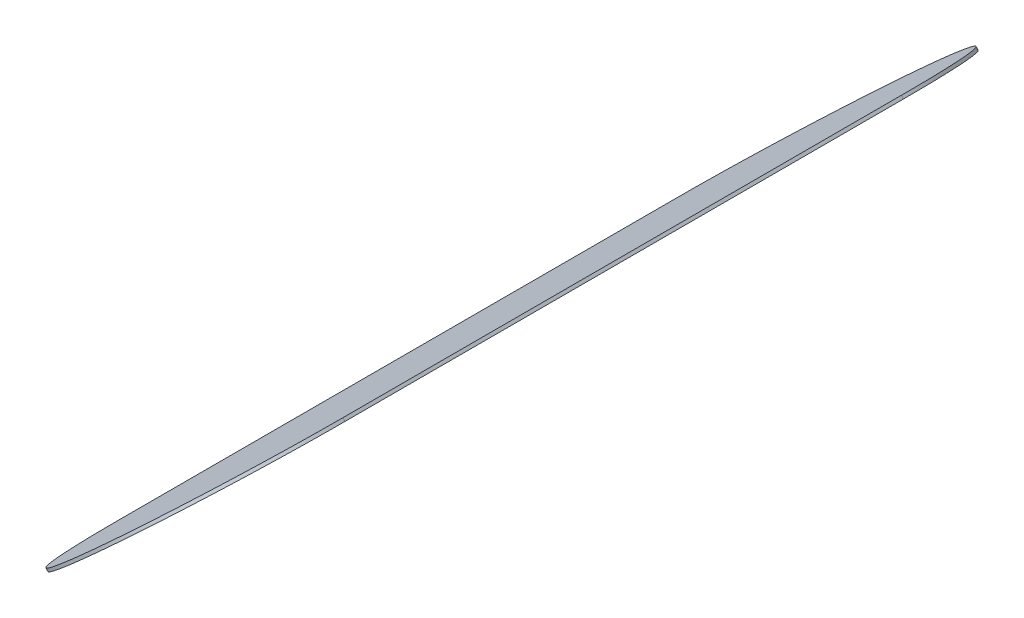
ISO-10303-21;
HEADER;
FILE_DESCRIPTION(('STEP AP214'),'2;1');
FILE_NAME('part.step','',(''),(''),'','','');
FILE_SCHEMA(('AUTOMOTIVE_DESIGN { 1 0 10303 214 1 1 1 1 }'));
ENDSEC;
DATA;
#1=APPLICATION_CONTEXT('core data for automotive mechanical design processes');
#2=APPLICATION_PROTOCOL_DEFINITION('international standard','automotive_design',2000,#1);
#3=PRODUCT_CONTEXT('',#1,'mechanical');
#4=PRODUCT('Part','Part','',(#3));
#5=PRODUCT_RELATED_PRODUCT_CATEGORY('part','',(#4));
#6=PRODUCT_DEFINITION_FORMATION('','',#4);
#7=PRODUCT_DEFINITION_CONTEXT('part definition',#1,'design');
#8=PRODUCT_DEFINITION('design','',#6,#7);
#9=PRODUCT_DEFINITION_SHAPE('','',#8);
#10=(LENGTH_UNIT() NAMED_UNIT(*) SI_UNIT(.MILLI.,.METRE.));
#11=(NAMED_UNIT(*) PLANE_ANGLE_UNIT() SI_UNIT($,.RADIAN.));
#12=(NAMED_UNIT(*) SI_UNIT($,.STERADIAN.) SOLID_ANGLE_UNIT());
#13=UNCERTAINTY_MEASURE_WITH_UNIT(LENGTH_MEASURE(1.E-05),#10,'distance_accuracy_value','');
#14=(GEOMETRIC_REPRESENTATION_CONTEXT(3) GLOBAL_UNCERTAINTY_ASSIGNED_CONTEXT((#13)) GLOBAL_UNIT_ASSIGNED_CONTEXT((#10,
#11,#12)) REPRESENTATION_CONTEXT('',''));
#15=CARTESIAN_POINT('',(0.,0.,0.));
#16=DIRECTION('',(0.,0.,1.));
#17=DIRECTION('',(1.,0.,0.));
#18=AXIS2_PLACEMENT_3D('',#15,#16,#17);
#19=CARTESIAN_POINT('',(-14.2740393675022,92.1058888495094,9.17000719853139));
#20=DIRECTION('',(-0.666666666666666,0.745355992499931,0.));
#21=DIRECTION('',(-0.745355992499931,-0.666666666666666,0.));
#22=AXIS2_PLACEMENT_3D('',#19,#20,#21);
#23=CYLINDRICAL_SURFACE('',#22,4.89999999999999);
#24=CARTESIAN_POINT('',(-14.3407060341689,92.1804244487594,9.17000719853139));
#25=DIRECTION('',(-0.666666666666666,0.745355992499931,0.));
#26=DIRECTION('',(-0.745355992499931,-0.666666666666666,0.));
#27=AXIS2_PLACEMENT_3D('',#24,#25,#26);
#28=CIRCLE('',#27,4.89999999999999);
#29=CARTESIAN_POINT('',(-17.9929503974185,88.9137577820927,9.17000719853139));
#30=VERTEX_POINT('',#29);
#31=CARTESIAN_POINT('',(-10.6884616709192,95.447091115426,9.17000719853139));
#32=VERTEX_POINT('',#31);
#33=EDGE_CURVE('E103',#30,#32,#28,.T.);
#34=ORIENTED_EDGE('',*,*,#33,.F.);
#35=DIRECTION('',(-0.666666666666666,0.745355992499931,0.));
#36=VECTOR('',#35,1.);
#37=CARTESIAN_POINT('',(-17.9262837307519,88.8392221828427,9.17000719853139));
#38=LINE('',#37,#36);
#39=CARTESIAN_POINT('',(-17.9262837307519,88.8392221828427,9.17000719853139));
#40=VERTEX_POINT('',#39);
#41=EDGE_CURVE('E11',#40,#30,#38,.T.);
#42=ORIENTED_EDGE('',*,*,#41,.F.);
#43=CARTESIAN_POINT('',(-14.2740393675022,92.1058888495094,9.17000719853139));
#44=DIRECTION('',(-0.666666666666666,0.745355992499931,0.));
#45=DIRECTION('',(-0.745355992499931,-0.666666666666666,0.));
#46=AXIS2_PLACEMENT_3D('',#43,#44,#45);
#47=CIRCLE('',#46,4.89999999999999);
#48=CARTESIAN_POINT('',(-10.6217950042525,95.372555516176,9.17000719853139));
#49=VERTEX_POINT('',#48);
#50=EDGE_CURVE('E97',#40,#49,#47,.T.);
#51=ORIENTED_EDGE('',*,*,#50,.T.);
#52=DIRECTION('',(-0.666666666666666,0.745355992499931,0.));
#53=VECTOR('',#52,1.);
#54=CARTESIAN_POINT('',(-10.6217950042525,95.372555516176,9.17000719853139));
#55=LINE('',#54,#53);
#56=EDGE_CURVE('E42',#49,#32,#55,.T.);
#57=ORIENTED_EDGE('',*,*,#56,.T.);
#58=EDGE_LOOP('',(#34,#42,#51,#57));
#59=FACE_BOUND('',#58,.T.);
#60=ADVANCED_FACE('F39',(#59),#23,.T.);
#61=CARTESIAN_POINT('',(-17.9262837307519,88.8392221828427,-9.17000719853139));
#62=DIRECTION('',(-0.745355992499931,-0.666666666666666,0.));
#63=DIRECTION('',(0.666666666666666,-0.745355992499931,0.));
#64=AXIS2_PLACEMENT_3D('',#61,#62,#63);
#65=PLANE('',#64);
#66=DIRECTION('',(0.,0.,1.));
#67=VECTOR('',#66,1.);
#68=CARTESIAN_POINT('',(-17.9929503974185,88.9137577820927,-9.17000719853139));
#69=LINE('',#68,#67);
#70=CARTESIAN_POINT('',(-17.9929503974185,88.9137577820927,-9.17000719853139));
#71=VERTEX_POINT('',#70);
#72=EDGE_CURVE('E99',#71,#30,#69,.T.);
#73=ORIENTED_EDGE('',*,*,#72,.F.);
#74=DIRECTION('',(-0.666666666666666,0.745355992499931,0.));
#75=VECTOR('',#74,1.);
#76=CARTESIAN_POINT('',(-17.9262837307518,88.8392221828427,-9.17000719853139));
#77=LINE('',#76,#75);
#78=CARTESIAN_POINT('',(-17.9262837307518,88.8392221828427,-9.17000719853139));
#79=VERTEX_POINT('',#78);
#80=EDGE_CURVE('E48',#79,#71,#77,.T.);
#81=ORIENTED_EDGE('',*,*,#80,.F.);
#82=DIRECTION('',(0.,0.,1.));
#83=VECTOR('',#82,1.);
#84=CARTESIAN_POINT('',(-17.9262837307519,88.8392221828427,-9.17000719853139));
#85=LINE('',#84,#83);
#86=EDGE_CURVE('E94',#79,#40,#85,.T.);
#87=ORIENTED_EDGE('',*,*,#86,.T.);
#88=ORIENTED_EDGE('',*,*,#41,.T.);
#89=EDGE_LOOP('',(#73,#81,#87,#88));
#90=FACE_BOUND('',#89,.T.);
#91=ADVANCED_FACE('F113',(#90),#65,.T.);
#92=CARTESIAN_POINT('',(-14.2740393675022,92.1058888495094,-9.17000719853139));
#93=DIRECTION('',(-0.666666666666666,0.745355992499931,0.));
#94=DIRECTION('',(-0.745355992499931,-0.666666666666666,0.));
#95=AXIS2_PLACEMENT_3D('',#92,#93,#94);
#96=CYLINDRICAL_SURFACE('',#95,4.9);
#97=CARTESIAN_POINT('',(-14.3407060341689,92.1804244487594,-9.17000719853139));
#98=DIRECTION('',(-0.666666666666666,0.745355992499931,0.));
#99=DIRECTION('',(-0.745355992499931,-0.666666666666666,0.));
#100=AXIS2_PLACEMENT_3D('',#97,#98,#99);
#101=CIRCLE('',#100,4.9);
#102=CARTESIAN_POINT('',(-10.6884616709192,95.447091115426,-9.17000719853139));
#103=VERTEX_POINT('',#102);
#104=EDGE_CURVE('E89',#103,#71,#101,.T.);
#105=ORIENTED_EDGE('',*,*,#104,.F.);
#106=DIRECTION('',(-0.666666666666666,0.745355992499931,0.));
#107=VECTOR('',#106,1.);
#108=CARTESIAN_POINT('',(-10.6217950042525,95.372555516176,-9.17000719853139));
#109=LINE('',#108,#107);
#110=CARTESIAN_POINT('',(-10.6217950042525,95.372555516176,-9.17000719853139));
#111=VERTEX_POINT('',#110);
#112=EDGE_CURVE('E84',#111,#103,#109,.T.);
#113=ORIENTED_EDGE('',*,*,#112,.F.);
#114=CARTESIAN_POINT('',(-14.2740393675022,92.1058888495094,-9.17000719853139));
#115=DIRECTION('',(-0.666666666666666,0.745355992499931,0.));
#116=DIRECTION('',(-0.745355992499931,-0.666666666666666,0.));
#117=AXIS2_PLACEMENT_3D('',#114,#115,#116);
#118=CIRCLE('',#117,4.9);
#119=EDGE_CURVE('E87',#111,#79,#118,.T.);
#120=ORIENTED_EDGE('',*,*,#119,.T.);
#121=ORIENTED_EDGE('',*,*,#80,.T.);
#122=EDGE_LOOP('',(#105,#113,#120,#121));
#123=FACE_BOUND('',#122,.T.);
#124=ADVANCED_FACE('F86',(#123),#96,.T.);
#125=CARTESIAN_POINT('',(-10.6217950042525,95.372555516176,9.17000719853139));
#126=DIRECTION('',(0.745355992499931,0.666666666666666,0.));
#127=DIRECTION('',(-0.666666666666666,0.745355992499931,0.));
#128=AXIS2_PLACEMENT_3D('',#125,#126,#127);
#129=PLANE('',#128);
#130=DIRECTION('',(0.,0.,-1.));
#131=VECTOR('',#130,1.);
#132=CARTESIAN_POINT('',(-10.6884616709192,95.447091115426,9.17000719853139));
#133=LINE('',#132,#131);
#134=EDGE_CURVE('E106',#32,#103,#133,.T.);
#135=ORIENTED_EDGE('',*,*,#134,.F.);
#136=ORIENTED_EDGE('',*,*,#56,.F.);
#137=DIRECTION('',(0.,0.,-1.));
#138=VECTOR('',#137,1.);
#139=CARTESIAN_POINT('',(-10.6217950042525,95.372555516176,9.17000719853139));
#140=LINE('',#139,#138);
#141=EDGE_CURVE('E93',#49,#111,#140,.T.);
#142=ORIENTED_EDGE('',*,*,#141,.T.);
#143=ORIENTED_EDGE('',*,*,#112,.T.);
#144=EDGE_LOOP('',(#135,#136,#142,#143));
#145=FACE_BOUND('',#144,.T.);
#146=ADVANCED_FACE('F96',(#145),#129,.T.);
#147=CARTESIAN_POINT('',(-14.2740393675022,92.1058888495094,9.17000719853139));
#148=DIRECTION('',(-0.666666666666666,0.745355992499931,0.));
#149=DIRECTION('',(-0.745355992499931,-0.666666666666666,0.));
#150=AXIS2_PLACEMENT_3D('',#147,#148,#149);
#151=PLANE('',#150);
#152=ORIENTED_EDGE('',*,*,#50,.F.);
#153=ORIENTED_EDGE('',*,*,#86,.F.);
#154=ORIENTED_EDGE('',*,*,#119,.F.);
#155=ORIENTED_EDGE('',*,*,#141,.F.);
#156=EDGE_LOOP('',(#152,#153,#154,#155));
#157=FACE_BOUND('',#156,.T.);
#158=ADVANCED_FACE('F92',(#157),#151,.F.);
#159=CARTESIAN_POINT('',(-14.3407060341689,92.1804244487594,9.17000719853139));
#160=DIRECTION('',(-0.666666666666666,0.745355992499931,0.));
#161=DIRECTION('',(-0.745355992499931,-0.666666666666666,0.));
#162=AXIS2_PLACEMENT_3D('',#159,#160,#161);
#163=PLANE('',#162);
#164=ORIENTED_EDGE('',*,*,#33,.T.);
#165=ORIENTED_EDGE('',*,*,#134,.T.);
#166=ORIENTED_EDGE('',*,*,#104,.T.);
#167=ORIENTED_EDGE('',*,*,#72,.T.);
#168=EDGE_LOOP('',(#164,#165,#166,#167));
#169=FACE_BOUND('',#168,.T.);
#170=ADVANCED_FACE('F112',(#169),#163,.T.);
#171=CLOSED_SHELL('',(#60,#91,#124,#146,#158,#170));
#172=MANIFOLD_SOLID_BREP('B2',#171);
#173=ADVANCED_BREP_SHAPE_REPRESENTATION('',(#18,#172),#14);
#174=SHAPE_DEFINITION_REPRESENTATION(#9,#173);
ENDSEC;
END-ISO-10303-21;
